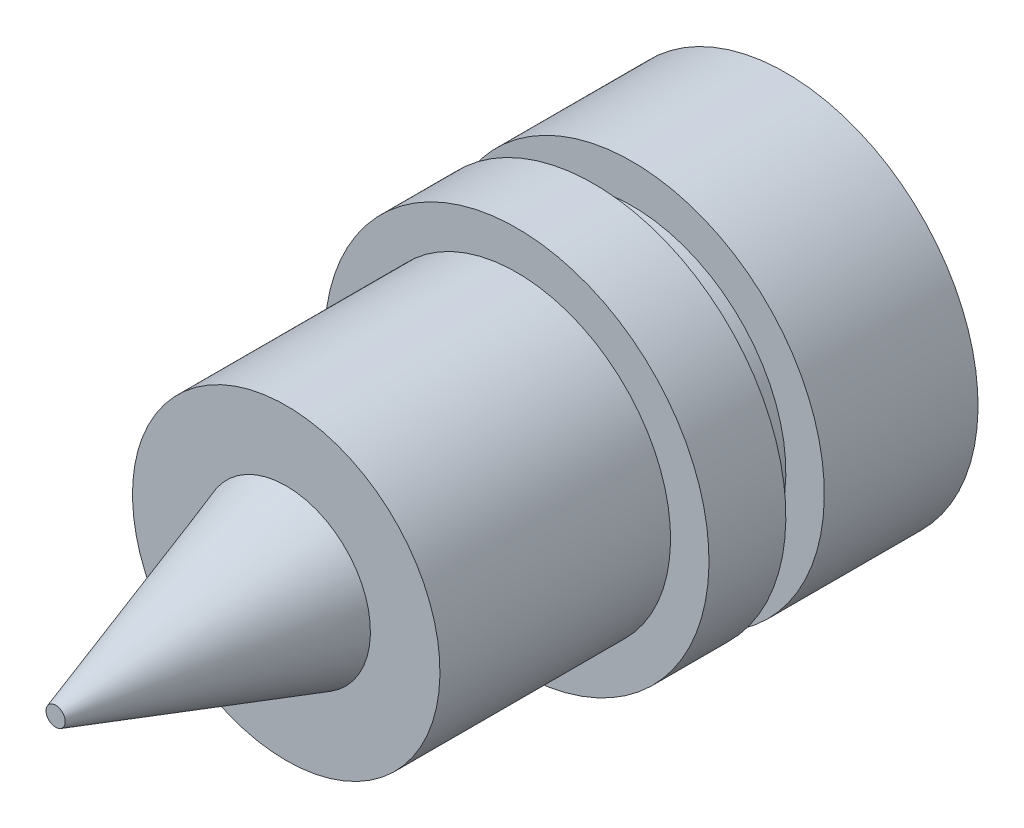
ISO-10303-21;
HEADER;
FILE_DESCRIPTION(('STEP AP214'),'2;1');
FILE_NAME('part.step','',(''),(''),'','','');
FILE_SCHEMA(('AUTOMOTIVE_DESIGN { 1 0 10303 214 1 1 1 1 }'));
ENDSEC;
DATA;
#1=APPLICATION_CONTEXT('core data for automotive mechanical design processes');
#2=APPLICATION_PROTOCOL_DEFINITION('international standard','automotive_design',2000,#1);
#3=PRODUCT_CONTEXT('',#1,'mechanical');
#4=PRODUCT('Part','Part','',(#3));
#5=PRODUCT_RELATED_PRODUCT_CATEGORY('part','',(#4));
#6=PRODUCT_DEFINITION_FORMATION('','',#4);
#7=PRODUCT_DEFINITION_CONTEXT('part definition',#1,'design');
#8=PRODUCT_DEFINITION('design','',#6,#7);
#9=PRODUCT_DEFINITION_SHAPE('','',#8);
#10=(LENGTH_UNIT() NAMED_UNIT(*) SI_UNIT(.MILLI.,.METRE.));
#11=(NAMED_UNIT(*) PLANE_ANGLE_UNIT() SI_UNIT($,.RADIAN.));
#12=(NAMED_UNIT(*) SI_UNIT($,.STERADIAN.) SOLID_ANGLE_UNIT());
#13=UNCERTAINTY_MEASURE_WITH_UNIT(LENGTH_MEASURE(1.E-05),#10,'distance_accuracy_value','');
#14=(GEOMETRIC_REPRESENTATION_CONTEXT(3) GLOBAL_UNCERTAINTY_ASSIGNED_CONTEXT((#13)) GLOBAL_UNIT_ASSIGNED_CONTEXT((#10,
#11,#12)) REPRESENTATION_CONTEXT('',''));
#15=CARTESIAN_POINT('',(0.,0.,0.));
#16=DIRECTION('',(0.,0.,1.));
#17=DIRECTION('',(1.,0.,0.));
#18=AXIS2_PLACEMENT_3D('',#15,#16,#17);
#19=CARTESIAN_POINT('',(0.,0.,0.));
#20=DIRECTION('',(0.,0.,1.));
#21=DIRECTION('',(0.,-1.,0.));
#22=AXIS2_PLACEMENT_3D('',#19,#20,#21);
#23=PLANE('',#22);
#24=DIRECTION('',(-1.,0.,0.));
#25=VECTOR('',#24,1.);
#26=CARTESIAN_POINT('',(-1.75,-0.5,0.));
#27=LINE('',#26,#25);
#28=CARTESIAN_POINT('',(1.75,-0.5,0.));
#29=VERTEX_POINT('',#28);
#30=CARTESIAN_POINT('',(-1.75,-0.5,0.));
#31=VERTEX_POINT('',#30);
#32=EDGE_CURVE('E82',#29,#31,#27,.T.);
#33=ORIENTED_EDGE('',*,*,#32,.F.);
#34=DIRECTION('',(0.,-1.,0.));
#35=VECTOR('',#34,1.);
#36=CARTESIAN_POINT('',(1.75,-0.5,0.));
#37=LINE('',#36,#35);
#38=CARTESIAN_POINT('',(1.75,0.5,0.));
#39=VERTEX_POINT('',#38);
#40=EDGE_CURVE('E47',#39,#29,#37,.T.);
#41=ORIENTED_EDGE('',*,*,#40,.F.);
#42=DIRECTION('',(1.,0.,0.));
#43=VECTOR('',#42,1.);
#44=CARTESIAN_POINT('',(-1.75,0.5,0.));
#45=LINE('',#44,#43);
#46=CARTESIAN_POINT('',(-1.75,0.5,0.));
#47=VERTEX_POINT('',#46);
#48=EDGE_CURVE('E98',#47,#39,#45,.T.);
#49=ORIENTED_EDGE('',*,*,#48,.F.);
#50=DIRECTION('',(0.,1.,0.));
#51=VECTOR('',#50,1.);
#52=CARTESIAN_POINT('',(-1.75,-0.5,0.));
#53=LINE('',#52,#51);
#54=EDGE_CURVE('E104',#31,#47,#53,.T.);
#55=ORIENTED_EDGE('',*,*,#54,.F.);
#56=EDGE_LOOP('',(#33,#41,#49,#55));
#57=FACE_BOUND('',#56,.T.);
#58=CARTESIAN_POINT('',(0.,0.,0.));
#59=DIRECTION('',(0.,0.,1.));
#60=DIRECTION('',(0.,-1.,0.));
#61=AXIS2_PLACEMENT_3D('',#58,#59,#60);
#62=CIRCLE('',#61,2.5);
#63=CARTESIAN_POINT('',(0.,-2.5,0.));
#64=VERTEX_POINT('',#63);
#65=EDGE_CURVE('E11',#64,#64,#62,.T.);
#66=ORIENTED_EDGE('',*,*,#65,.F.);
#67=EDGE_LOOP('',(#66));
#68=FACE_BOUND('',#67,.T.);
#69=ADVANCED_FACE('F33',(#57,#68),#23,.F.);
#70=CARTESIAN_POINT('',(0.,0.,9.5));
#71=DIRECTION('',(0.,0.,1.));
#72=DIRECTION('',(0.,-1.,0.));
#73=AXIS2_PLACEMENT_3D('',#70,#71,#72);
#74=CYLINDRICAL_SURFACE('',#73,2.5);
#75=CARTESIAN_POINT('',(0.,0.,2.));
#76=DIRECTION('',(0.,0.,1.));
#77=DIRECTION('',(0.,-1.,0.));
#78=AXIS2_PLACEMENT_3D('',#75,#76,#77);
#79=CIRCLE('',#78,2.5);
#80=CARTESIAN_POINT('',(0.,-2.5,2.));
#81=VERTEX_POINT('',#80);
#82=EDGE_CURVE('E40',#81,#81,#79,.T.);
#83=ORIENTED_EDGE('',*,*,#82,.F.);
#84=EDGE_LOOP('',(#83));
#85=FACE_BOUND('',#84,.T.);
#86=ORIENTED_EDGE('',*,*,#65,.T.);
#87=EDGE_LOOP('',(#86));
#88=FACE_BOUND('',#87,.T.);
#89=ADVANCED_FACE('F138',(#85,#88),#74,.T.);
#90=CARTESIAN_POINT('',(0.,2.,2.));
#91=DIRECTION('',(0.,0.,-1.));
#92=DIRECTION('',(0.,1.,0.));
#93=AXIS2_PLACEMENT_3D('',#90,#91,#92);
#94=PLANE('',#93);
#95=CARTESIAN_POINT('',(0.,0.,2.));
#96=DIRECTION('',(0.,0.,1.));
#97=DIRECTION('',(0.,-1.,0.));
#98=AXIS2_PLACEMENT_3D('',#95,#96,#97);
#99=CIRCLE('',#98,2.);
#100=CARTESIAN_POINT('',(0.,-2.,2.));
#101=VERTEX_POINT('',#100);
#102=EDGE_CURVE('E131',#101,#101,#99,.T.);
#103=ORIENTED_EDGE('',*,*,#102,.F.);
#104=EDGE_LOOP('',(#103));
#105=FACE_BOUND('',#104,.T.);
#106=ORIENTED_EDGE('',*,*,#82,.T.);
#107=EDGE_LOOP('',(#106));
#108=FACE_BOUND('',#107,.T.);
#109=ADVANCED_FACE('F136',(#105,#108),#94,.F.);
#110=CARTESIAN_POINT('',(0.,0.,9.5));
#111=DIRECTION('',(0.,0.,1.));
#112=DIRECTION('',(0.,-1.,0.));
#113=AXIS2_PLACEMENT_3D('',#110,#111,#112);
#114=CYLINDRICAL_SURFACE('',#113,2.);
#115=CARTESIAN_POINT('',(0.,0.,2.5));
#116=DIRECTION('',(0.,0.,1.));
#117=DIRECTION('',(0.,-1.,0.));
#118=AXIS2_PLACEMENT_3D('',#115,#116,#117);
#119=CIRCLE('',#118,2.);
#120=CARTESIAN_POINT('',(0.,-2.,2.5));
#121=VERTEX_POINT('',#120);
#122=EDGE_CURVE('E128',#121,#121,#119,.T.);
#123=ORIENTED_EDGE('',*,*,#122,.F.);
#124=EDGE_LOOP('',(#123));
#125=FACE_BOUND('',#124,.T.);
#126=ORIENTED_EDGE('',*,*,#102,.T.);
#127=EDGE_LOOP('',(#126));
#128=FACE_BOUND('',#127,.T.);
#129=ADVANCED_FACE('F189',(#125,#128),#114,.T.);
#130=CARTESIAN_POINT('',(0.,2.5,2.5));
#131=DIRECTION('',(0.,0.,1.));
#132=DIRECTION('',(0.,-1.,0.));
#133=AXIS2_PLACEMENT_3D('',#130,#131,#132);
#134=PLANE('',#133);
#135=CARTESIAN_POINT('',(0.,0.,2.5));
#136=DIRECTION('',(0.,0.,1.));
#137=DIRECTION('',(0.,-1.,0.));
#138=AXIS2_PLACEMENT_3D('',#135,#136,#137);
#139=CIRCLE('',#138,2.5);
#140=CARTESIAN_POINT('',(0.,-2.5,2.5));
#141=VERTEX_POINT('',#140);
#142=EDGE_CURVE('E125',#141,#141,#139,.T.);
#143=ORIENTED_EDGE('',*,*,#142,.F.);
#144=EDGE_LOOP('',(#143));
#145=FACE_BOUND('',#144,.T.);
#146=ORIENTED_EDGE('',*,*,#122,.T.);
#147=EDGE_LOOP('',(#146));
#148=FACE_BOUND('',#147,.T.);
#149=ADVANCED_FACE('F185',(#145,#148),#134,.F.);
#150=CARTESIAN_POINT('',(0.,0.,9.5));
#151=DIRECTION('',(0.,0.,1.));
#152=DIRECTION('',(0.,-1.,0.));
#153=AXIS2_PLACEMENT_3D('',#150,#151,#152);
#154=CYLINDRICAL_SURFACE('',#153,2.5);
#155=CARTESIAN_POINT('',(0.,0.,3.5));
#156=DIRECTION('',(0.,0.,1.));
#157=DIRECTION('',(0.,-1.,0.));
#158=AXIS2_PLACEMENT_3D('',#155,#156,#157);
#159=CIRCLE('',#158,2.5);
#160=CARTESIAN_POINT('',(0.,-2.5,3.5));
#161=VERTEX_POINT('',#160);
#162=EDGE_CURVE('E122',#161,#161,#159,.T.);
#163=ORIENTED_EDGE('',*,*,#162,.F.);
#164=EDGE_LOOP('',(#163));
#165=FACE_BOUND('',#164,.T.);
#166=ORIENTED_EDGE('',*,*,#142,.T.);
#167=EDGE_LOOP('',(#166));
#168=FACE_BOUND('',#167,.T.);
#169=ADVANCED_FACE('F181',(#165,#168),#154,.T.);
#170=CARTESIAN_POINT('',(0.,2.5,3.5));
#171=DIRECTION('',(0.,0.,-1.));
#172=DIRECTION('',(0.,1.,0.));
#173=AXIS2_PLACEMENT_3D('',#170,#171,#172);
#174=PLANE('',#173);
#175=CARTESIAN_POINT('',(0.,0.,3.5));
#176=DIRECTION('',(0.,0.,1.));
#177=DIRECTION('',(0.,-1.,0.));
#178=AXIS2_PLACEMENT_3D('',#175,#176,#177);
#179=CIRCLE('',#178,2.);
#180=CARTESIAN_POINT('',(0.,-2.,3.5));
#181=VERTEX_POINT('',#180);
#182=EDGE_CURVE('E119',#181,#181,#179,.T.);
#183=ORIENTED_EDGE('',*,*,#182,.F.);
#184=EDGE_LOOP('',(#183));
#185=FACE_BOUND('',#184,.T.);
#186=ORIENTED_EDGE('',*,*,#162,.T.);
#187=EDGE_LOOP('',(#186));
#188=FACE_BOUND('',#187,.T.);
#189=ADVANCED_FACE('F177',(#185,#188),#174,.F.);
#190=CARTESIAN_POINT('',(0.,0.,9.5));
#191=DIRECTION('',(0.,0.,1.));
#192=DIRECTION('',(0.,-1.,0.));
#193=AXIS2_PLACEMENT_3D('',#190,#191,#192);
#194=CYLINDRICAL_SURFACE('',#193,2.);
#195=CARTESIAN_POINT('',(0.,0.,6.5));
#196=DIRECTION('',(0.,0.,1.));
#197=DIRECTION('',(0.,-1.,0.));
#198=AXIS2_PLACEMENT_3D('',#195,#196,#197);
#199=CIRCLE('',#198,2.);
#200=CARTESIAN_POINT('',(0.,-2.,6.5));
#201=VERTEX_POINT('',#200);
#202=EDGE_CURVE('E116',#201,#201,#199,.T.);
#203=ORIENTED_EDGE('',*,*,#202,.F.);
#204=EDGE_LOOP('',(#203));
#205=FACE_BOUND('',#204,.T.);
#206=ORIENTED_EDGE('',*,*,#182,.T.);
#207=EDGE_LOOP('',(#206));
#208=FACE_BOUND('',#207,.T.);
#209=ADVANCED_FACE('F173',(#205,#208),#194,.T.);
#210=CARTESIAN_POINT('',(0.,2.,6.5));
#211=DIRECTION('',(0.,0.,-1.));
#212=DIRECTION('',(0.,1.,0.));
#213=AXIS2_PLACEMENT_3D('',#210,#211,#212);
#214=PLANE('',#213);
#215=CARTESIAN_POINT('',(0.,0.,6.5));
#216=DIRECTION('',(0.,0.,1.));
#217=DIRECTION('',(0.,-1.,0.));
#218=AXIS2_PLACEMENT_3D('',#215,#216,#217);
#219=CIRCLE('',#218,1.09551612683094);
#220=CARTESIAN_POINT('',(0.,1.09551612683094,6.5));
#221=VERTEX_POINT('',#220);
#222=EDGE_CURVE('E113',#221,#221,#219,.T.);
#223=ORIENTED_EDGE('',*,*,#222,.F.);
#224=EDGE_LOOP('',(#223));
#225=FACE_BOUND('',#224,.T.);
#226=ORIENTED_EDGE('',*,*,#202,.T.);
#227=EDGE_LOOP('',(#226));
#228=FACE_BOUND('',#227,.T.);
#229=ADVANCED_FACE('F169',(#225,#228),#214,.F.);
#230=CARTESIAN_POINT('',(0.,0.,6.5));
#231=DIRECTION('',(0.,0.,-1.));
#232=DIRECTION('',(0.,1.,0.));
#233=AXIS2_PLACEMENT_3D('',#230,#231,#232);
#234=CONICAL_SURFACE('',#233,1.09551612683094,0.312879469078447);
#235=CARTESIAN_POINT('',(0.,0.,9.5));
#236=DIRECTION('',(0.,0.,1.));
#237=DIRECTION('',(0.,-1.,0.));
#238=AXIS2_PLACEMENT_3D('',#235,#236,#237);
#239=CIRCLE('',#238,0.125);
#240=CARTESIAN_POINT('',(0.,0.125,9.5));
#241=VERTEX_POINT('',#240);
#242=EDGE_CURVE('E108',#241,#241,#239,.T.);
#243=CARTESIAN_POINT('',(0.,0.125,9.5));
#244=CARTESIAN_POINT('',(0.,0.135109542987823,9.46875));
#245=CARTESIAN_POINT('',(0.,0.145219085975645,9.4375));
#246=CARTESIAN_POINT('',(0.,0.16543817195129,9.375));
#247=CARTESIAN_POINT('',(0.,0.175547714939112,9.34375));
#248=CARTESIAN_POINT('',(0.,0.195766800914757,9.28125));
#249=CARTESIAN_POINT('',(0.,0.205876343902579,9.25));
#250=CARTESIAN_POINT('',(0.,0.226095429878224,9.1875));
#251=CARTESIAN_POINT('',(0.,0.236204972866046,9.15625));
#252=CARTESIAN_POINT('',(0.,0.256424058841691,9.09375));
#253=CARTESIAN_POINT('',(0.,0.266533601829513,9.0625));
#254=CARTESIAN_POINT('',(0.,0.286752687805158,9.));
#255=CARTESIAN_POINT('',(0.,0.29686223079298,8.96875));
#256=CARTESIAN_POINT('',(0.,0.317081316768625,8.90625));
#257=CARTESIAN_POINT('',(0.,0.327190859756447,8.875));
#258=CARTESIAN_POINT('',(0.,0.347409945732092,8.8125));
#259=CARTESIAN_POINT('',(0.,0.357519488719914,8.78125));
#260=CARTESIAN_POINT('',(0.,0.377738574695559,8.71875));
#261=CARTESIAN_POINT('',(0.,0.387848117683381,8.6875));
#262=CARTESIAN_POINT('',(0.,0.408067203659026,8.625));
#263=CARTESIAN_POINT('',(0.,0.418176746646848,8.59375));
#264=CARTESIAN_POINT('',(0.,0.438395832622493,8.53125));
#265=CARTESIAN_POINT('',(0.,0.448505375610315,8.5));
#266=CARTESIAN_POINT('',(0.,0.46872446158596,8.4375));
#267=CARTESIAN_POINT('',(0.,0.478834004573782,8.40625));
#268=CARTESIAN_POINT('',(0.,0.499053090549427,8.34375));
#269=CARTESIAN_POINT('',(0.,0.509162633537249,8.3125));
#270=CARTESIAN_POINT('',(0.,0.529381719512894,8.25));
#271=CARTESIAN_POINT('',(0.,0.539491262500716,8.21875));
#272=CARTESIAN_POINT('',(0.,0.559710348476361,8.15625));
#273=CARTESIAN_POINT('',(0.,0.569819891464183,8.125));
#274=CARTESIAN_POINT('',(0.,0.590038977439828,8.0625));
#275=CARTESIAN_POINT('',(0.,0.60014852042765,8.03125));
#276=CARTESIAN_POINT('',(0.,0.620367606403295,7.96875));
#277=CARTESIAN_POINT('',(0.,0.630477149391117,7.9375));
#278=CARTESIAN_POINT('',(0.,0.650696235366761,7.875));
#279=CARTESIAN_POINT('',(0.,0.660805778354584,7.84375));
#280=CARTESIAN_POINT('',(0.,0.681024864330229,7.78125));
#281=CARTESIAN_POINT('',(0.,0.691134407318051,7.75));
#282=CARTESIAN_POINT('',(0.,0.711353493293696,7.6875));
#283=CARTESIAN_POINT('',(0.,0.721463036281518,7.65625));
#284=CARTESIAN_POINT('',(0.,0.741682122257163,7.59375));
#285=CARTESIAN_POINT('',(0.,0.751791665244985,7.5625));
#286=CARTESIAN_POINT('',(0.,0.77201075122063,7.5));
#287=CARTESIAN_POINT('',(0.,0.782120294208452,7.46875));
#288=CARTESIAN_POINT('',(0.,0.802339380184097,7.40625));
#289=CARTESIAN_POINT('',(0.,0.812448923171919,7.375));
#290=CARTESIAN_POINT('',(0.,0.832668009147564,7.3125));
#291=CARTESIAN_POINT('',(0.,0.842777552135386,7.28125));
#292=CARTESIAN_POINT('',(0.,0.862996638111031,7.21875));
#293=CARTESIAN_POINT('',(0.,0.873106181098853,7.1875));
#294=CARTESIAN_POINT('',(0.,0.893325267074498,7.125));
#295=CARTESIAN_POINT('',(0.,0.90343481006232,7.09375));
#296=CARTESIAN_POINT('',(0.,0.923653896037965,7.03125));
#297=CARTESIAN_POINT('',(0.,0.933763439025787,7.));
#298=CARTESIAN_POINT('',(0.,0.953982525001432,6.9375));
#299=CARTESIAN_POINT('',(0.,0.964092067989254,6.90625));
#300=CARTESIAN_POINT('',(0.,0.984311153964899,6.84375));
#301=CARTESIAN_POINT('',(0.,0.994420696952721,6.8125));
#302=CARTESIAN_POINT('',(0.,1.01463978292837,6.75));
#303=CARTESIAN_POINT('',(0.,1.02474932591619,6.71875));
#304=CARTESIAN_POINT('',(0.,1.04496841189183,6.65625));
#305=CARTESIAN_POINT('',(0.,1.05507795487965,6.625));
#306=CARTESIAN_POINT('',(0.,1.0752970408553,6.5625));
#307=CARTESIAN_POINT('',(0.,1.08540658384312,6.53125));
#308=CARTESIAN_POINT('',(0.,1.09551612683094,6.5));
#309=B_SPLINE_CURVE_WITH_KNOTS('',3,(#243,#244,#245,#246,#247,#248,#249,#250,#251,#252,#253,
#254,#255,#256,#257,#258,#259,#260,#261,#262,#263,#264,#265,#266,#267,#268,#269,#270,#271,#272,
#273,#274,#275,#276,#277,#278,#279,#280,#281,#282,#283,#284,#285,#286,#287,#288,#289,#290,#291,
#292,#293,#294,#295,#296,#297,#298,#299,#300,#301,#302,#303,#304,#305,#306,#307,#308),
.UNSPECIFIED.,.F.,.F.,(4,2,2,2,2,2,2,2,2,2,2,2,2,2,2,2,2,2,2,2,2,2,2,2,2,2,2,2,2,2,2,2,4),(0.,
0.0985336908615711,0.197067381723142,0.295601072584713,0.394134763446284,0.492668454307856,
0.591202145169427,0.689735836030998,0.788269526892569,0.88680321775414,0.985336908615711,
1.08387059947728,1.18240429033885,1.28093798120042,1.379471672062,1.47800536292357,
1.57653905378514,1.67507274464671,1.77360643550828,1.87214012636985,1.97067381723142,
2.06920750809299,2.16774119895456,2.26627488981614,2.36480858067771,2.46334227153928,
2.56187596240085,2.66040965326242,2.75894334412399,2.85747703498556,2.95601072584713,
3.0545444167087,3.15307810757028),.UNSPECIFIED.);
#310=EDGE_CURVE('BSEAM165',#241,#221,#309,.T.);
#311=ORIENTED_EDGE('',*,*,#242,.F.);
#312=ORIENTED_EDGE('',*,*,#222,.T.);
#313=ORIENTED_EDGE('',*,*,#310,.T.);
#314=ORIENTED_EDGE('',*,*,#310,.F.);
#315=EDGE_LOOP('',(#311,#313,#312,#314));
#316=FACE_BOUND('',#315,.T.);
#317=ADVANCED_FACE('F165',(#316),#234,.T.);
#318=CARTESIAN_POINT('',(0.,0.125,9.5));
#319=DIRECTION('',(0.,0.,-1.));
#320=DIRECTION('',(0.,1.,0.));
#321=AXIS2_PLACEMENT_3D('',#318,#319,#320);
#322=PLANE('',#321);
#323=ORIENTED_EDGE('',*,*,#242,.T.);
#324=EDGE_LOOP('',(#323));
#325=FACE_BOUND('',#324,.T.);
#326=ADVANCED_FACE('F157',(#325),#322,.F.);
#327=CARTESIAN_POINT('',(1.75,-0.5,1.));
#328=DIRECTION('',(1.,0.,0.));
#329=DIRECTION('',(0.,0.,-1.));
#330=AXIS2_PLACEMENT_3D('',#327,#328,#329);
#331=PLANE('',#330);
#332=ORIENTED_EDGE('',*,*,#40,.T.);
#333=DIRECTION('',(0.,0.,-1.));
#334=VECTOR('',#333,1.);
#335=CARTESIAN_POINT('',(1.75,-0.5,1.));
#336=LINE('',#335,#334);
#337=CARTESIAN_POINT('',(1.75,-0.5,1.));
#338=VERTEX_POINT('',#337);
#339=EDGE_CURVE('E70',#338,#29,#336,.T.);
#340=ORIENTED_EDGE('',*,*,#339,.F.);
#341=DIRECTION('',(0.,-1.,0.));
#342=VECTOR('',#341,1.);
#343=CARTESIAN_POINT('',(1.75,-0.5,1.));
#344=LINE('',#343,#342);
#345=CARTESIAN_POINT('',(1.75,0.5,1.));
#346=VERTEX_POINT('',#345);
#347=EDGE_CURVE('E96',#346,#338,#344,.T.);
#348=ORIENTED_EDGE('',*,*,#347,.F.);
#349=DIRECTION('',(0.,0.,-1.));
#350=VECTOR('',#349,1.);
#351=CARTESIAN_POINT('',(1.75,0.5,1.));
#352=LINE('',#351,#350);
#353=EDGE_CURVE('E55',#346,#39,#352,.T.);
#354=ORIENTED_EDGE('',*,*,#353,.T.);
#355=EDGE_LOOP('',(#332,#340,#348,#354));
#356=FACE_BOUND('',#355,.T.);
#357=ADVANCED_FACE('F150',(#356),#331,.F.);
#358=CARTESIAN_POINT('',(-1.75,0.5,1.));
#359=DIRECTION('',(0.,1.,0.));
#360=DIRECTION('',(-1.,0.,0.));
#361=AXIS2_PLACEMENT_3D('',#358,#359,#360);
#362=PLANE('',#361);
#363=ORIENTED_EDGE('',*,*,#48,.T.);
#364=ORIENTED_EDGE('',*,*,#353,.F.);
#365=DIRECTION('',(1.,0.,0.));
#366=VECTOR('',#365,1.);
#367=CARTESIAN_POINT('',(-1.75,0.5,1.));
#368=LINE('',#367,#366);
#369=CARTESIAN_POINT('',(-1.75,0.5,1.));
#370=VERTEX_POINT('',#369);
#371=EDGE_CURVE('E93',#370,#346,#368,.T.);
#372=ORIENTED_EDGE('',*,*,#371,.F.);
#373=DIRECTION('',(0.,0.,-1.));
#374=VECTOR('',#373,1.);
#375=CARTESIAN_POINT('',(-1.75,0.5,1.));
#376=LINE('',#375,#374);
#377=EDGE_CURVE('E86',#370,#47,#376,.T.);
#378=ORIENTED_EDGE('',*,*,#377,.T.);
#379=EDGE_LOOP('',(#363,#364,#372,#378));
#380=FACE_BOUND('',#379,.T.);
#381=ADVANCED_FACE('F148',(#380),#362,.F.);
#382=CARTESIAN_POINT('',(-1.75,-0.5,1.));
#383=DIRECTION('',(-1.,0.,0.));
#384=DIRECTION('',(0.,0.,1.));
#385=AXIS2_PLACEMENT_3D('',#382,#383,#384);
#386=PLANE('',#385);
#387=ORIENTED_EDGE('',*,*,#54,.T.);
#388=ORIENTED_EDGE('',*,*,#377,.F.);
#389=DIRECTION('',(0.,1.,0.));
#390=VECTOR('',#389,1.);
#391=CARTESIAN_POINT('',(-1.75,-0.5,1.));
#392=LINE('',#391,#390);
#393=CARTESIAN_POINT('',(-1.75,-0.5,1.));
#394=VERTEX_POINT('',#393);
#395=EDGE_CURVE('E89',#394,#370,#392,.T.);
#396=ORIENTED_EDGE('',*,*,#395,.F.);
#397=DIRECTION('',(0.,0.,-1.));
#398=VECTOR('',#397,1.);
#399=CARTESIAN_POINT('',(-1.75,-0.5,1.));
#400=LINE('',#399,#398);
#401=EDGE_CURVE('E75',#394,#31,#400,.T.);
#402=ORIENTED_EDGE('',*,*,#401,.T.);
#403=EDGE_LOOP('',(#387,#388,#396,#402));
#404=FACE_BOUND('',#403,.T.);
#405=ADVANCED_FACE('F90',(#404),#386,.F.);
#406=CARTESIAN_POINT('',(-1.75,-0.5,1.));
#407=DIRECTION('',(0.,-1.,0.));
#408=DIRECTION('',(1.,0.,0.));
#409=AXIS2_PLACEMENT_3D('',#406,#407,#408);
#410=PLANE('',#409);
#411=ORIENTED_EDGE('',*,*,#32,.T.);
#412=ORIENTED_EDGE('',*,*,#401,.F.);
#413=DIRECTION('',(-1.,0.,0.));
#414=VECTOR('',#413,1.);
#415=CARTESIAN_POINT('',(-1.75,-0.5,1.));
#416=LINE('',#415,#414);
#417=EDGE_CURVE('E79',#338,#394,#416,.T.);
#418=ORIENTED_EDGE('',*,*,#417,.F.);
#419=ORIENTED_EDGE('',*,*,#339,.T.);
#420=EDGE_LOOP('',(#411,#412,#418,#419));
#421=FACE_BOUND('',#420,.T.);
#422=ADVANCED_FACE('F77',(#421),#410,.F.);
#423=CARTESIAN_POINT('',(0.,0.,1.));
#424=DIRECTION('',(0.,0.,-1.));
#425=DIRECTION('',(0.,1.,0.));
#426=AXIS2_PLACEMENT_3D('',#423,#424,#425);
#427=PLANE('',#426);
#428=ORIENTED_EDGE('',*,*,#347,.T.);
#429=ORIENTED_EDGE('',*,*,#417,.T.);
#430=ORIENTED_EDGE('',*,*,#395,.T.);
#431=ORIENTED_EDGE('',*,*,#371,.T.);
#432=EDGE_LOOP('',(#428,#429,#430,#431));
#433=FACE_BOUND('',#432,.T.);
#434=ADVANCED_FACE('F95',(#433),#427,.T.);
#435=CLOSED_SHELL('',(#69,#89,#109,#129,#149,#169,#189,#209,#229,#317,#326,#357,#381,#405,#422,#434));
#436=MANIFOLD_SOLID_BREP('B2',#435);
#437=ADVANCED_BREP_SHAPE_REPRESENTATION('',(#18,#436),#14);
#438=SHAPE_DEFINITION_REPRESENTATION(#9,#437);
ENDSEC;
END-ISO-10303-21;
